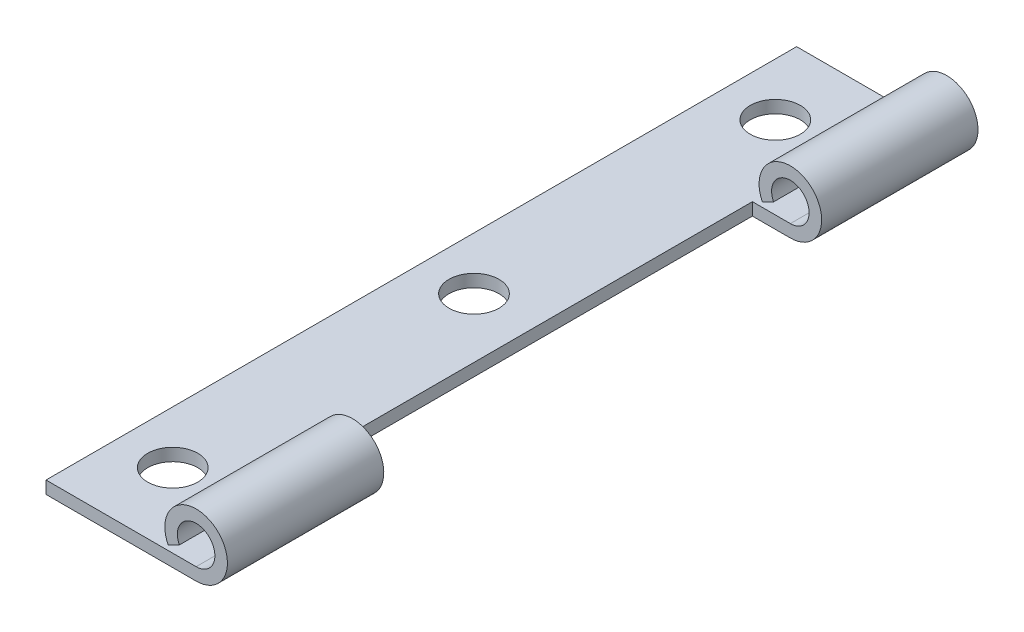
ISO-10303-21;
HEADER;
FILE_DESCRIPTION(('STEP AP214'),'2;1');
FILE_NAME('part.step','',(''),(''),'','','');
FILE_SCHEMA(('AUTOMOTIVE_DESIGN { 1 0 10303 214 1 1 1 1 }'));
ENDSEC;
DATA;
#1=APPLICATION_CONTEXT('core data for automotive mechanical design processes');
#2=APPLICATION_PROTOCOL_DEFINITION('international standard','automotive_design',2000,#1);
#3=PRODUCT_CONTEXT('',#1,'mechanical');
#4=PRODUCT('Part','Part','',(#3));
#5=PRODUCT_RELATED_PRODUCT_CATEGORY('part','',(#4));
#6=PRODUCT_DEFINITION_FORMATION('','',#4);
#7=PRODUCT_DEFINITION_CONTEXT('part definition',#1,'design');
#8=PRODUCT_DEFINITION('design','',#6,#7);
#9=PRODUCT_DEFINITION_SHAPE('','',#8);
#10=(LENGTH_UNIT() NAMED_UNIT(*) SI_UNIT(.MILLI.,.METRE.));
#11=(NAMED_UNIT(*) PLANE_ANGLE_UNIT() SI_UNIT($,.RADIAN.));
#12=(NAMED_UNIT(*) SI_UNIT($,.STERADIAN.) SOLID_ANGLE_UNIT());
#13=UNCERTAINTY_MEASURE_WITH_UNIT(LENGTH_MEASURE(1.E-05),#10,'distance_accuracy_value','');
#14=(GEOMETRIC_REPRESENTATION_CONTEXT(3) GLOBAL_UNCERTAINTY_ASSIGNED_CONTEXT((#13)) GLOBAL_UNIT_ASSIGNED_CONTEXT((#10,
#11,#12)) REPRESENTATION_CONTEXT('',''));
#15=CARTESIAN_POINT('',(0.,0.,0.));
#16=DIRECTION('',(0.,0.,1.));
#17=DIRECTION('',(1.,0.,0.));
#18=AXIS2_PLACEMENT_3D('',#15,#16,#17);
#19=CARTESIAN_POINT('',(12.,2.5,0.));
#20=DIRECTION('',(0.,0.,1.));
#21=DIRECTION('',(1.,0.,0.));
#22=AXIS2_PLACEMENT_3D('',#19,#20,#21);
#23=CYLINDRICAL_SURFACE('',#22,1.5);
#24=CARTESIAN_POINT('',(12.,2.5,12.5));
#25=DIRECTION('',(0.,0.,-1.));
#26=DIRECTION('',(-1.,0.,0.));
#27=AXIS2_PLACEMENT_3D('',#24,#25,#26);
#28=CIRCLE('',#27,1.5);
#29=CARTESIAN_POINT('',(10.6574644433918,1.83097213866484,12.5));
#30=VERTEX_POINT('',#29);
#31=CARTESIAN_POINT('',(12.,0.999999999999996,12.5));
#32=VERTEX_POINT('',#31);
#33=EDGE_CURVE('E158',#30,#32,#28,.T.);
#34=ORIENTED_EDGE('',*,*,#33,.F.);
#35=DIRECTION('',(0.,0.,1.));
#36=VECTOR('',#35,1.);
#37=CARTESIAN_POINT('',(10.6574644433918,1.83097213866484,0.));
#38=LINE('',#37,#36);
#39=CARTESIAN_POINT('',(10.6574644433918,1.83097213866484,0.));
#40=VERTEX_POINT('',#39);
#41=EDGE_CURVE('E56',#40,#30,#38,.T.);
#42=ORIENTED_EDGE('',*,*,#41,.F.);
#43=CARTESIAN_POINT('',(12.,2.5,0.));
#44=DIRECTION('',(0.,0.,1.));
#45=DIRECTION('',(1.,0.,0.));
#46=AXIS2_PLACEMENT_3D('',#43,#44,#45);
#47=CIRCLE('',#46,1.5);
#48=CARTESIAN_POINT('',(12.,1.,0.));
#49=VERTEX_POINT('',#48);
#50=EDGE_CURVE('E212',#49,#40,#47,.T.);
#51=ORIENTED_EDGE('',*,*,#50,.F.);
#52=DIRECTION('',(0.,0.,1.));
#53=VECTOR('',#52,1.);
#54=CARTESIAN_POINT('',(12.,1.,0.));
#55=LINE('',#54,#53);
#56=EDGE_CURVE('E165',#49,#32,#55,.T.);
#57=ORIENTED_EDGE('',*,*,#56,.T.);
#58=EDGE_LOOP('',(#34,#42,#51,#57));
#59=FACE_BOUND('',#58,.T.);
#60=ADVANCED_FACE('F33',(#59),#23,.F.);
#61=CARTESIAN_POINT('',(12.,2.5,0.));
#62=DIRECTION('',(0.,0.,1.));
#63=DIRECTION('',(1.,0.,0.));
#64=AXIS2_PLACEMENT_3D('',#61,#62,#63);
#65=CYLINDRICAL_SURFACE('',#64,2.5);
#66=CARTESIAN_POINT('',(12.,2.5,47.5));
#67=DIRECTION('',(0.,0.,1.));
#68=DIRECTION('',(0.,-1.,0.));
#69=AXIS2_PLACEMENT_3D('',#66,#67,#68);
#70=CIRCLE('',#69,2.5);
#71=CARTESIAN_POINT('',(9.76244073898631,1.3849535644414,47.5));
#72=VERTEX_POINT('',#71);
#73=CARTESIAN_POINT('',(12.,0.,47.5));
#74=VERTEX_POINT('',#73);
#75=EDGE_CURVE('E139',#72,#74,#70,.F.);
#76=ORIENTED_EDGE('',*,*,#75,.F.);
#77=DIRECTION('',(0.,0.,-1.));
#78=VECTOR('',#77,1.);
#79=CARTESIAN_POINT('',(9.76244073898632,1.38495356444141,0.));
#80=LINE('',#79,#78);
#81=CARTESIAN_POINT('',(9.76244073898631,1.3849535644414,60.));
#82=VERTEX_POINT('',#81);
#83=EDGE_CURVE('E195',#82,#72,#80,.T.);
#84=ORIENTED_EDGE('',*,*,#83,.F.);
#85=CARTESIAN_POINT('',(12.,2.5,60.));
#86=DIRECTION('',(0.,0.,1.));
#87=DIRECTION('',(1.,0.,0.));
#88=AXIS2_PLACEMENT_3D('',#85,#86,#87);
#89=CIRCLE('',#88,2.50000000000001);
#90=CARTESIAN_POINT('',(12.,0.,60.));
#91=VERTEX_POINT('',#90);
#92=EDGE_CURVE('E206',#91,#82,#89,.T.);
#93=ORIENTED_EDGE('',*,*,#92,.F.);
#94=DIRECTION('',(0.,0.,-1.));
#95=VECTOR('',#94,1.);
#96=CARTESIAN_POINT('',(12.,0.,0.));
#97=LINE('',#96,#95);
#98=EDGE_CURVE('E170',#91,#74,#97,.T.);
#99=ORIENTED_EDGE('',*,*,#98,.T.);
#100=EDGE_LOOP('',(#76,#84,#93,#99));
#101=FACE_BOUND('',#100,.T.);
#102=ADVANCED_FACE('F219',(#101),#65,.T.);
#103=CARTESIAN_POINT('',(9.76244073898632,1.38495356444141,0.));
#104=DIRECTION('',(0.446018574223438,-0.895023704405471,0.));
#105=DIRECTION('',(0.,0.,-1.));
#106=AXIS2_PLACEMENT_3D('',#103,#104,#105);
#107=PLANE('',#106);
#108=DIRECTION('',(0.895023704405471,0.446018574223438,0.));
#109=VECTOR('',#108,1.);
#110=CARTESIAN_POINT('',(9.76244073898631,1.3849535644414,12.5));
#111=LINE('',#110,#109);
#112=CARTESIAN_POINT('',(9.76244073898631,1.3849535644414,12.5));
#113=VERTEX_POINT('',#112);
#114=EDGE_CURVE('E11',#113,#30,#111,.T.);
#115=ORIENTED_EDGE('',*,*,#114,.F.);
#116=CARTESIAN_POINT('',(9.76244073898632,1.38495356444141,0.));
#117=VERTEX_POINT('',#116);
#118=EDGE_CURVE('E194',#113,#117,#80,.T.);
#119=ORIENTED_EDGE('',*,*,#118,.T.);
#120=DIRECTION('',(0.895023704405471,0.446018574223438,0.));
#121=VECTOR('',#120,1.);
#122=CARTESIAN_POINT('',(9.76244073898632,1.38495356444141,0.));
#123=LINE('',#122,#121);
#124=EDGE_CURVE('E192',#117,#40,#123,.T.);
#125=ORIENTED_EDGE('',*,*,#124,.T.);
#126=ORIENTED_EDGE('',*,*,#41,.T.);
#127=EDGE_LOOP('',(#115,#119,#125,#126));
#128=FACE_BOUND('',#127,.T.);
#129=ADVANCED_FACE('F241',(#128),#107,.T.);
#130=CARTESIAN_POINT('',(12.,2.5,47.5));
#131=DIRECTION('',(0.,0.,1.));
#132=DIRECTION('',(0.,-1.,0.));
#133=AXIS2_PLACEMENT_3D('',#130,#131,#132);
#134=CIRCLE('',#133,1.5);
#135=CARTESIAN_POINT('',(12.,0.999999999999996,47.5));
#136=VERTEX_POINT('',#135);
#137=CARTESIAN_POINT('',(10.6574644433918,1.83097213866484,47.5));
#138=VERTEX_POINT('',#137);
#139=EDGE_CURVE('E48',#136,#138,#134,.T.);
#140=ORIENTED_EDGE('',*,*,#139,.F.);
#141=CARTESIAN_POINT('',(12.,0.999999999999993,60.));
#142=VERTEX_POINT('',#141);
#143=EDGE_CURVE('E169',#136,#142,#55,.T.);
#144=ORIENTED_EDGE('',*,*,#143,.T.);
#145=CARTESIAN_POINT('',(12.,2.5,60.));
#146=DIRECTION('',(0.,0.,1.));
#147=DIRECTION('',(1.,0.,0.));
#148=AXIS2_PLACEMENT_3D('',#145,#146,#147);
#149=CIRCLE('',#148,1.50000000000001);
#150=CARTESIAN_POINT('',(10.6574644433918,1.83097213866484,60.));
#151=VERTEX_POINT('',#150);
#152=EDGE_CURVE('E209',#142,#151,#149,.T.);
#153=ORIENTED_EDGE('',*,*,#152,.T.);
#154=EDGE_CURVE('E201',#138,#151,#38,.T.);
#155=ORIENTED_EDGE('',*,*,#154,.F.);
#156=EDGE_LOOP('',(#140,#144,#153,#155));
#157=FACE_BOUND('',#156,.T.);
#158=ADVANCED_FACE('F35',(#157),#23,.F.);
#159=CARTESIAN_POINT('',(12.,2.5,12.5));
#160=DIRECTION('',(0.,0.,-1.));
#161=DIRECTION('',(-1.,0.,0.));
#162=AXIS2_PLACEMENT_3D('',#159,#160,#161);
#163=CIRCLE('',#162,2.5);
#164=CARTESIAN_POINT('',(12.,0.,12.5));
#165=VERTEX_POINT('',#164);
#166=EDGE_CURVE('E153',#165,#113,#163,.F.);
#167=ORIENTED_EDGE('',*,*,#166,.F.);
#168=CARTESIAN_POINT('',(12.,0.,0.));
#169=VERTEX_POINT('',#168);
#170=EDGE_CURVE('E168',#165,#169,#97,.T.);
#171=ORIENTED_EDGE('',*,*,#170,.T.);
#172=CARTESIAN_POINT('',(12.,2.5,0.));
#173=DIRECTION('',(0.,0.,1.));
#174=DIRECTION('',(1.,0.,0.));
#175=AXIS2_PLACEMENT_3D('',#172,#173,#174);
#176=CIRCLE('',#175,2.5);
#177=EDGE_CURVE('E203',#169,#117,#176,.T.);
#178=ORIENTED_EDGE('',*,*,#177,.T.);
#179=ORIENTED_EDGE('',*,*,#118,.F.);
#180=EDGE_LOOP('',(#167,#171,#178,#179));
#181=FACE_BOUND('',#180,.T.);
#182=ADVANCED_FACE('F235',(#181),#65,.T.);
#183=CARTESIAN_POINT('',(12.,0.,0.));
#184=DIRECTION('',(0.,0.,1.));
#185=DIRECTION('',(1.,0.,0.));
#186=AXIS2_PLACEMENT_3D('',#183,#184,#185);
#187=PLANE('',#186);
#188=DIRECTION('',(0.,1.,0.));
#189=VECTOR('',#188,1.);
#190=CARTESIAN_POINT('',(0.,0.,0.));
#191=LINE('',#190,#189);
#192=CARTESIAN_POINT('',(0.,0.,0.));
#193=VERTEX_POINT('',#192);
#194=CARTESIAN_POINT('',(0.,1.,0.));
#195=VERTEX_POINT('',#194);
#196=EDGE_CURVE('E164',#193,#195,#191,.T.);
#197=ORIENTED_EDGE('',*,*,#196,.T.);
#198=DIRECTION('',(-1.,0.,0.));
#199=VECTOR('',#198,1.);
#200=CARTESIAN_POINT('',(12.,1.,0.));
#201=LINE('',#200,#199);
#202=EDGE_CURVE('E189',#49,#195,#201,.T.);
#203=ORIENTED_EDGE('',*,*,#202,.F.);
#204=ORIENTED_EDGE('',*,*,#50,.T.);
#205=ORIENTED_EDGE('',*,*,#124,.F.);
#206=ORIENTED_EDGE('',*,*,#177,.F.);
#207=DIRECTION('',(-1.,0.,0.));
#208=VECTOR('',#207,1.);
#209=CARTESIAN_POINT('',(12.,0.,0.));
#210=LINE('',#209,#208);
#211=EDGE_CURVE('E172',#169,#193,#210,.T.);
#212=ORIENTED_EDGE('',*,*,#211,.T.);
#213=EDGE_LOOP('',(#197,#203,#204,#205,#206,#212));
#214=FACE_BOUND('',#213,.T.);
#215=ADVANCED_FACE('F230',(#214),#187,.F.);
#216=CARTESIAN_POINT('',(12.,1.,0.));
#217=DIRECTION('',(0.,-1.,0.));
#218=DIRECTION('',(0.,0.,-1.));
#219=AXIS2_PLACEMENT_3D('',#216,#217,#218);
#220=PLANE('',#219);
#221=CARTESIAN_POINT('',(4.21292614379829,0.999999999999996,30.));
#222=DIRECTION('',(0.,1.,0.));
#223=DIRECTION('',(0.,0.,1.));
#224=AXIS2_PLACEMENT_3D('',#221,#222,#223);
#225=CIRCLE('',#224,2.);
#226=CARTESIAN_POINT('',(4.21292614379829,0.999999999999996,32.));
#227=VERTEX_POINT('',#226);
#228=EDGE_CURVE('E315',#227,#227,#225,.T.);
#229=ORIENTED_EDGE('',*,*,#228,.F.);
#230=EDGE_LOOP('',(#229));
#231=FACE_BOUND('',#230,.T.);
#232=CARTESIAN_POINT('',(4.21292614383147,0.999999999999993,54.0827124087731));
#233=DIRECTION('',(0.,1.,0.));
#234=DIRECTION('',(0.,0.,-1.));
#235=AXIS2_PLACEMENT_3D('',#232,#233,#234);
#236=CIRCLE('',#235,2.);
#237=CARTESIAN_POINT('',(4.21292614383147,0.999999999999994,52.0827124087731));
#238=VERTEX_POINT('',#237);
#239=EDGE_CURVE('E317',#238,#238,#236,.T.);
#240=ORIENTED_EDGE('',*,*,#239,.F.);
#241=EDGE_LOOP('',(#240));
#242=FACE_BOUND('',#241,.T.);
#243=CARTESIAN_POINT('',(4.21292614383147,0.999999999999999,5.91728759122693));
#244=DIRECTION('',(0.,1.,0.));
#245=DIRECTION('',(0.,0.,1.));
#246=AXIS2_PLACEMENT_3D('',#243,#244,#245);
#247=CIRCLE('',#246,2.);
#248=CARTESIAN_POINT('',(4.21292614383147,0.999999999999999,7.91728759122694));
#249=VERTEX_POINT('',#248);
#250=EDGE_CURVE('E323',#249,#249,#247,.T.);
#251=ORIENTED_EDGE('',*,*,#250,.F.);
#252=EDGE_LOOP('',(#251));
#253=FACE_BOUND('',#252,.T.);
#254=DIRECTION('',(0.,0.,-1.));
#255=VECTOR('',#254,1.);
#256=CARTESIAN_POINT('',(8.96459075496534,1.,0.));
#257=LINE('',#256,#255);
#258=CARTESIAN_POINT('',(8.96459075496534,0.999999999999994,47.5));
#259=VERTEX_POINT('',#258);
#260=CARTESIAN_POINT('',(8.96459075496534,0.999999999999997,12.5));
#261=VERTEX_POINT('',#260);
#262=EDGE_CURVE('E131',#259,#261,#257,.T.);
#263=ORIENTED_EDGE('',*,*,#262,.T.);
#264=DIRECTION('',(1.,0.,0.));
#265=VECTOR('',#264,1.);
#266=CARTESIAN_POINT('',(12.,0.999999999999999,12.5));
#267=LINE('',#266,#265);
#268=EDGE_CURVE('E160',#261,#32,#267,.T.);
#269=ORIENTED_EDGE('',*,*,#268,.T.);
#270=ORIENTED_EDGE('',*,*,#56,.F.);
#271=ORIENTED_EDGE('',*,*,#202,.T.);
#272=DIRECTION('',(0.,0.,1.));
#273=VECTOR('',#272,1.);
#274=CARTESIAN_POINT('',(0.,1.,0.));
#275=LINE('',#274,#273);
#276=CARTESIAN_POINT('',(0.,0.999999999999993,60.));
#277=VERTEX_POINT('',#276);
#278=EDGE_CURVE('E175',#195,#277,#275,.T.);
#279=ORIENTED_EDGE('',*,*,#278,.T.);
#280=DIRECTION('',(-1.,0.,0.));
#281=VECTOR('',#280,1.);
#282=CARTESIAN_POINT('',(12.,0.999999999999993,60.));
#283=LINE('',#282,#281);
#284=EDGE_CURVE('E186',#142,#277,#283,.T.);
#285=ORIENTED_EDGE('',*,*,#284,.F.);
#286=ORIENTED_EDGE('',*,*,#143,.F.);
#287=DIRECTION('',(-1.,0.,0.));
#288=VECTOR('',#287,1.);
#289=CARTESIAN_POINT('',(12.,0.999999999999994,47.5));
#290=LINE('',#289,#288);
#291=EDGE_CURVE('E154',#136,#259,#290,.T.);
#292=ORIENTED_EDGE('',*,*,#291,.T.);
#293=EDGE_LOOP('',(#263,#269,#270,#271,#279,#285,#286,#292));
#294=FACE_BOUND('',#293,.T.);
#295=ADVANCED_FACE('F244',(#231,#242,#253,#294),#220,.F.);
#296=CARTESIAN_POINT('',(12.,0.,60.));
#297=DIRECTION('',(0.,0.,-1.));
#298=DIRECTION('',(-1.,0.,0.));
#299=AXIS2_PLACEMENT_3D('',#296,#297,#298);
#300=PLANE('',#299);
#301=DIRECTION('',(0.,-1.,0.));
#302=VECTOR('',#301,1.);
#303=CARTESIAN_POINT('',(0.,0.,60.));
#304=LINE('',#303,#302);
#305=CARTESIAN_POINT('',(0.,0.,60.));
#306=VERTEX_POINT('',#305);
#307=EDGE_CURVE('E177',#277,#306,#304,.T.);
#308=ORIENTED_EDGE('',*,*,#307,.T.);
#309=DIRECTION('',(-1.,0.,0.));
#310=VECTOR('',#309,1.);
#311=CARTESIAN_POINT('',(12.,0.,60.));
#312=LINE('',#311,#310);
#313=EDGE_CURVE('E183',#91,#306,#312,.T.);
#314=ORIENTED_EDGE('',*,*,#313,.F.);
#315=ORIENTED_EDGE('',*,*,#92,.T.);
#316=DIRECTION('',(-0.895023704405471,-0.446018574223438,0.));
#317=VECTOR('',#316,1.);
#318=CARTESIAN_POINT('',(9.76244073898631,1.3849535644414,60.));
#319=LINE('',#318,#317);
#320=EDGE_CURVE('E198',#151,#82,#319,.T.);
#321=ORIENTED_EDGE('',*,*,#320,.F.);
#322=ORIENTED_EDGE('',*,*,#152,.F.);
#323=ORIENTED_EDGE('',*,*,#284,.T.);
#324=EDGE_LOOP('',(#308,#314,#315,#321,#322,#323));
#325=FACE_BOUND('',#324,.T.);
#326=ADVANCED_FACE('F249',(#325),#300,.F.);
#327=CARTESIAN_POINT('',(12.,0.,0.));
#328=DIRECTION('',(0.,1.,0.));
#329=DIRECTION('',(0.,0.,1.));
#330=AXIS2_PLACEMENT_3D('',#327,#328,#329);
#331=PLANE('',#330);
#332=CARTESIAN_POINT('',(4.21292614379829,0.,30.));
#333=DIRECTION('',(0.,1.,0.));
#334=DIRECTION('',(0.,0.,1.));
#335=AXIS2_PLACEMENT_3D('',#332,#333,#334);
#336=CIRCLE('',#335,2.);
#337=CARTESIAN_POINT('',(4.21292614379829,0.,32.));
#338=VERTEX_POINT('',#337);
#339=EDGE_CURVE('E312',#338,#338,#336,.T.);
#340=ORIENTED_EDGE('',*,*,#339,.T.);
#341=EDGE_LOOP('',(#340));
#342=FACE_BOUND('',#341,.T.);
#343=CARTESIAN_POINT('',(4.21292614383147,0.,54.0827124087731));
#344=DIRECTION('',(0.,1.,0.));
#345=DIRECTION('',(0.,0.,-1.));
#346=AXIS2_PLACEMENT_3D('',#343,#344,#345);
#347=CIRCLE('',#346,2.);
#348=CARTESIAN_POINT('',(4.21292614383147,0.,52.0827124087731));
#349=VERTEX_POINT('',#348);
#350=EDGE_CURVE('E320',#349,#349,#347,.T.);
#351=ORIENTED_EDGE('',*,*,#350,.T.);
#352=EDGE_LOOP('',(#351));
#353=FACE_BOUND('',#352,.T.);
#354=CARTESIAN_POINT('',(4.21292614383147,0.,5.91728759122693));
#355=DIRECTION('',(0.,1.,0.));
#356=DIRECTION('',(0.,0.,1.));
#357=AXIS2_PLACEMENT_3D('',#354,#355,#356);
#358=CIRCLE('',#357,2.);
#359=CARTESIAN_POINT('',(4.21292614383147,0.,7.91728759122694));
#360=VERTEX_POINT('',#359);
#361=EDGE_CURVE('E143',#360,#360,#358,.T.);
#362=ORIENTED_EDGE('',*,*,#361,.T.);
#363=EDGE_LOOP('',(#362));
#364=FACE_BOUND('',#363,.T.);
#365=ORIENTED_EDGE('',*,*,#170,.F.);
#366=DIRECTION('',(1.,0.,0.));
#367=VECTOR('',#366,1.);
#368=CARTESIAN_POINT('',(8.96459075496534,0.,12.5));
#369=LINE('',#368,#367);
#370=CARTESIAN_POINT('',(8.96459075496534,0.,12.5));
#371=VERTEX_POINT('',#370);
#372=EDGE_CURVE('E134',#371,#165,#369,.T.);
#373=ORIENTED_EDGE('',*,*,#372,.F.);
#374=DIRECTION('',(0.,0.,-1.));
#375=VECTOR('',#374,1.);
#376=CARTESIAN_POINT('',(8.96459075496534,0.,47.5));
#377=LINE('',#376,#375);
#378=CARTESIAN_POINT('',(8.96459075496534,0.,47.5));
#379=VERTEX_POINT('',#378);
#380=EDGE_CURVE('E128',#379,#371,#377,.T.);
#381=ORIENTED_EDGE('',*,*,#380,.F.);
#382=DIRECTION('',(-1.,0.,0.));
#383=VECTOR('',#382,1.);
#384=CARTESIAN_POINT('',(8.96459075496534,0.,47.5));
#385=LINE('',#384,#383);
#386=EDGE_CURVE('E137',#74,#379,#385,.T.);
#387=ORIENTED_EDGE('',*,*,#386,.F.);
#388=ORIENTED_EDGE('',*,*,#98,.F.);
#389=ORIENTED_EDGE('',*,*,#313,.T.);
#390=DIRECTION('',(0.,0.,-1.));
#391=VECTOR('',#390,1.);
#392=CARTESIAN_POINT('',(0.,0.,0.));
#393=LINE('',#392,#391);
#394=EDGE_CURVE('E179',#306,#193,#393,.T.);
#395=ORIENTED_EDGE('',*,*,#394,.T.);
#396=ORIENTED_EDGE('',*,*,#211,.F.);
#397=EDGE_LOOP('',(#365,#373,#381,#387,#388,#389,#395,#396));
#398=FACE_BOUND('',#397,.T.);
#399=ADVANCED_FACE('F146',(#342,#353,#364,#398),#331,.F.);
#400=DIRECTION('',(-0.895023704405471,-0.446018574223438,0.));
#401=VECTOR('',#400,1.);
#402=CARTESIAN_POINT('',(9.76244073898632,1.38495356444141,47.5));
#403=LINE('',#402,#401);
#404=EDGE_CURVE('E41',#138,#72,#403,.T.);
#405=ORIENTED_EDGE('',*,*,#404,.F.);
#406=ORIENTED_EDGE('',*,*,#154,.T.);
#407=ORIENTED_EDGE('',*,*,#320,.T.);
#408=ORIENTED_EDGE('',*,*,#83,.T.);
#409=EDGE_LOOP('',(#405,#406,#407,#408));
#410=FACE_BOUND('',#409,.T.);
#411=ADVANCED_FACE('F216',(#410),#107,.T.);
#412=CARTESIAN_POINT('',(0.,0.,0.));
#413=DIRECTION('',(1.,0.,0.));
#414=DIRECTION('',(0.,0.,-1.));
#415=AXIS2_PLACEMENT_3D('',#412,#413,#414);
#416=PLANE('',#415);
#417=ORIENTED_EDGE('',*,*,#196,.F.);
#418=ORIENTED_EDGE('',*,*,#394,.F.);
#419=ORIENTED_EDGE('',*,*,#307,.F.);
#420=ORIENTED_EDGE('',*,*,#278,.F.);
#421=EDGE_LOOP('',(#417,#418,#419,#420));
#422=FACE_BOUND('',#421,.T.);
#423=ADVANCED_FACE('F227',(#422),#416,.F.);
#424=CARTESIAN_POINT('',(8.96459075496534,5.00000000000001,47.5));
#425=DIRECTION('',(-1.,0.,0.));
#426=DIRECTION('',(0.,0.,1.));
#427=AXIS2_PLACEMENT_3D('',#424,#425,#426);
#428=PLANE('',#427);
#429=DIRECTION('',(0.,-1.,0.));
#430=VECTOR('',#429,1.);
#431=CARTESIAN_POINT('',(8.96459075496534,5.00000000000001,47.5));
#432=LINE('',#431,#430);
#433=EDGE_CURVE('E123',#259,#379,#432,.T.);
#434=ORIENTED_EDGE('',*,*,#433,.T.);
#435=ORIENTED_EDGE('',*,*,#380,.T.);
#436=DIRECTION('',(0.,-1.,0.));
#437=VECTOR('',#436,1.);
#438=CARTESIAN_POINT('',(8.96459075496534,5.00000000000001,12.5));
#439=LINE('',#438,#437);
#440=EDGE_CURVE('E133',#261,#371,#439,.T.);
#441=ORIENTED_EDGE('',*,*,#440,.F.);
#442=ORIENTED_EDGE('',*,*,#262,.F.);
#443=EDGE_LOOP('',(#434,#435,#441,#442));
#444=FACE_BOUND('',#443,.T.);
#445=ADVANCED_FACE('F125',(#444),#428,.F.);
#446=CARTESIAN_POINT('',(8.96459075496534,5.00000000000001,12.5));
#447=DIRECTION('',(0.,0.,-1.));
#448=DIRECTION('',(-1.,0.,0.));
#449=AXIS2_PLACEMENT_3D('',#446,#447,#448);
#450=PLANE('',#449);
#451=ORIENTED_EDGE('',*,*,#440,.T.);
#452=ORIENTED_EDGE('',*,*,#372,.T.);
#453=ORIENTED_EDGE('',*,*,#166,.T.);
#454=ORIENTED_EDGE('',*,*,#114,.T.);
#455=ORIENTED_EDGE('',*,*,#33,.T.);
#456=ORIENTED_EDGE('',*,*,#268,.F.);
#457=EDGE_LOOP('',(#451,#452,#453,#454,#455,#456));
#458=FACE_BOUND('',#457,.T.);
#459=ADVANCED_FACE('F239',(#458),#450,.F.);
#460=CARTESIAN_POINT('',(8.96459075496534,5.00000000000001,47.5));
#461=DIRECTION('',(0.,0.,1.));
#462=DIRECTION('',(0.,-1.,0.));
#463=AXIS2_PLACEMENT_3D('',#460,#461,#462);
#464=PLANE('',#463);
#465=ORIENTED_EDGE('',*,*,#75,.T.);
#466=ORIENTED_EDGE('',*,*,#386,.T.);
#467=ORIENTED_EDGE('',*,*,#433,.F.);
#468=ORIENTED_EDGE('',*,*,#291,.F.);
#469=ORIENTED_EDGE('',*,*,#139,.T.);
#470=ORIENTED_EDGE('',*,*,#404,.T.);
#471=EDGE_LOOP('',(#465,#466,#467,#468,#469,#470));
#472=FACE_BOUND('',#471,.T.);
#473=ADVANCED_FACE('F138',(#472),#464,.F.);
#474=CARTESIAN_POINT('',(4.21292614383147,0.,5.91728759122693));
#475=DIRECTION('',(0.,1.,0.));
#476=DIRECTION('',(0.,0.,1.));
#477=AXIS2_PLACEMENT_3D('',#474,#475,#476);
#478=CYLINDRICAL_SURFACE('',#477,2.);
#479=ORIENTED_EDGE('',*,*,#361,.F.);
#480=EDGE_LOOP('',(#479));
#481=FACE_BOUND('',#480,.T.);
#482=ORIENTED_EDGE('',*,*,#250,.T.);
#483=EDGE_LOOP('',(#482));
#484=FACE_BOUND('',#483,.T.);
#485=ADVANCED_FACE('F290',(#481,#484),#478,.F.);
#486=CARTESIAN_POINT('',(4.21292614383147,0.,54.0827124087731));
#487=DIRECTION('',(0.,1.,0.));
#488=DIRECTION('',(0.,0.,1.));
#489=AXIS2_PLACEMENT_3D('',#486,#487,#488);
#490=CYLINDRICAL_SURFACE('',#489,2.);
#491=ORIENTED_EDGE('',*,*,#350,.F.);
#492=EDGE_LOOP('',(#491));
#493=FACE_BOUND('',#492,.T.);
#494=ORIENTED_EDGE('',*,*,#239,.T.);
#495=EDGE_LOOP('',(#494));
#496=FACE_BOUND('',#495,.T.);
#497=ADVANCED_FACE('F294',(#493,#496),#490,.F.);
#498=CARTESIAN_POINT('',(4.21292614379829,0.,30.));
#499=DIRECTION('',(0.,1.,0.));
#500=DIRECTION('',(0.,0.,1.));
#501=AXIS2_PLACEMENT_3D('',#498,#499,#500);
#502=CYLINDRICAL_SURFACE('',#501,2.);
#503=ORIENTED_EDGE('',*,*,#339,.F.);
#504=EDGE_LOOP('',(#503));
#505=FACE_BOUND('',#504,.T.);
#506=ORIENTED_EDGE('',*,*,#228,.T.);
#507=EDGE_LOOP('',(#506));
#508=FACE_BOUND('',#507,.T.);
#509=ADVANCED_FACE('F299',(#505,#508),#502,.F.);
#510=CLOSED_SHELL('',(#60,#102,#129,#158,#182,#215,#295,#326,#399,#411,#423,#445,#459,#473,#485,
#497,#509));
#511=MANIFOLD_SOLID_BREP('B2',#510);
#512=ADVANCED_BREP_SHAPE_REPRESENTATION('',(#18,#511),#14);
#513=SHAPE_DEFINITION_REPRESENTATION(#9,#512);
ENDSEC;
END-ISO-10303-21;
